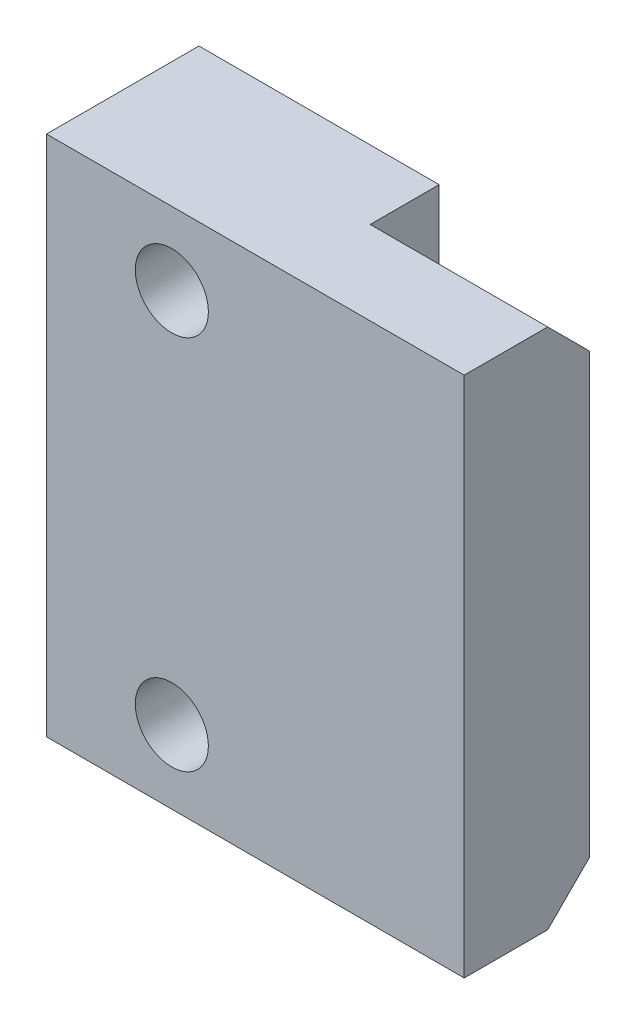
ISO-10303-21;
HEADER;
FILE_DESCRIPTION(('STEP AP214'),'2;1');
FILE_NAME('part.step','',(''),(''),'','','');
FILE_SCHEMA(('AUTOMOTIVE_DESIGN { 1 0 10303 214 1 1 1 1 }'));
ENDSEC;
DATA;
#1=APPLICATION_CONTEXT('core data for automotive mechanical design processes');
#2=APPLICATION_PROTOCOL_DEFINITION('international standard','automotive_design',2000,#1);
#3=PRODUCT_CONTEXT('',#1,'mechanical');
#4=PRODUCT('Part','Part','',(#3));
#5=PRODUCT_RELATED_PRODUCT_CATEGORY('part','',(#4));
#6=PRODUCT_DEFINITION_FORMATION('','',#4);
#7=PRODUCT_DEFINITION_CONTEXT('part definition',#1,'design');
#8=PRODUCT_DEFINITION('design','',#6,#7);
#9=PRODUCT_DEFINITION_SHAPE('','',#8);
#10=(LENGTH_UNIT() NAMED_UNIT(*) SI_UNIT(.MILLI.,.METRE.));
#11=(NAMED_UNIT(*) PLANE_ANGLE_UNIT() SI_UNIT($,.RADIAN.));
#12=(NAMED_UNIT(*) SI_UNIT($,.STERADIAN.) SOLID_ANGLE_UNIT());
#13=UNCERTAINTY_MEASURE_WITH_UNIT(LENGTH_MEASURE(1.E-05),#10,'distance_accuracy_value','');
#14=(GEOMETRIC_REPRESENTATION_CONTEXT(3) GLOBAL_UNCERTAINTY_ASSIGNED_CONTEXT((#13)) GLOBAL_UNIT_ASSIGNED_CONTEXT((#10,
#11,#12)) REPRESENTATION_CONTEXT('',''));
#15=CARTESIAN_POINT('',(0.,0.,0.));
#16=DIRECTION('',(0.,0.,1.));
#17=DIRECTION('',(1.,0.,0.));
#18=AXIS2_PLACEMENT_3D('',#15,#16,#17);
#19=CARTESIAN_POINT('',(-10.,12.5,-7.3));
#20=DIRECTION('',(1.,0.,0.));
#21=DIRECTION('',(0.,0.,-1.));
#22=AXIS2_PLACEMENT_3D('',#19,#20,#21);
#23=PLANE('',#22);
#24=DIRECTION('',(0.,0.,1.));
#25=VECTOR('',#24,1.);
#26=CARTESIAN_POINT('',(-10.,-12.5,-7.3));
#27=LINE('',#26,#25);
#28=CARTESIAN_POINT('',(-10.,-12.5,-7.3));
#29=VERTEX_POINT('',#28);
#30=CARTESIAN_POINT('',(-10.,-12.5,0.));
#31=VERTEX_POINT('',#30);
#32=EDGE_CURVE('E120',#29,#31,#27,.T.);
#33=ORIENTED_EDGE('',*,*,#32,.T.);
#34=DIRECTION('',(0.,-1.,0.));
#35=VECTOR('',#34,1.);
#36=CARTESIAN_POINT('',(-10.,12.5,0.));
#37=LINE('',#36,#35);
#38=CARTESIAN_POINT('',(-10.,12.5,0.));
#39=VERTEX_POINT('',#38);
#40=EDGE_CURVE('E102',#39,#31,#37,.T.);
#41=ORIENTED_EDGE('',*,*,#40,.F.);
#42=DIRECTION('',(0.,0.,1.));
#43=VECTOR('',#42,1.);
#44=CARTESIAN_POINT('',(-10.,12.5,-7.3));
#45=LINE('',#44,#43);
#46=CARTESIAN_POINT('',(-10.,12.5,-7.3));
#47=VERTEX_POINT('',#46);
#48=EDGE_CURVE('E108',#47,#39,#45,.T.);
#49=ORIENTED_EDGE('',*,*,#48,.F.);
#50=DIRECTION('',(0.,-1.,0.));
#51=VECTOR('',#50,1.);
#52=CARTESIAN_POINT('',(-10.,12.5,-7.3));
#53=LINE('',#52,#51);
#54=EDGE_CURVE('E165',#47,#29,#53,.T.);
#55=ORIENTED_EDGE('',*,*,#54,.T.);
#56=EDGE_LOOP('',(#33,#41,#49,#55));
#57=FACE_BOUND('',#56,.T.);
#58=ADVANCED_FACE('F32',(#57),#23,.F.);
#59=CARTESIAN_POINT('',(-10.,12.5,0.));
#60=DIRECTION('',(0.,0.,-1.));
#61=DIRECTION('',(-1.,0.,0.));
#62=AXIS2_PLACEMENT_3D('',#59,#60,#61);
#63=PLANE('',#62);
#64=CARTESIAN_POINT('',(-4.,-9.,0.));
#65=DIRECTION('',(0.,0.,1.));
#66=DIRECTION('',(1.,0.,0.));
#67=AXIS2_PLACEMENT_3D('',#64,#65,#66);
#68=CIRCLE('',#67,1.75);
#69=CARTESIAN_POINT('',(-2.25,-9.,0.));
#70=VERTEX_POINT('',#69);
#71=EDGE_CURVE('E187',#70,#70,#68,.T.);
#72=ORIENTED_EDGE('',*,*,#71,.F.);
#73=EDGE_LOOP('',(#72));
#74=FACE_BOUND('',#73,.T.);
#75=CARTESIAN_POINT('',(-4.,9.,0.));
#76=DIRECTION('',(0.,0.,1.));
#77=DIRECTION('',(1.,0.,0.));
#78=AXIS2_PLACEMENT_3D('',#75,#76,#77);
#79=CIRCLE('',#78,1.75);
#80=CARTESIAN_POINT('',(-2.25,9.,0.));
#81=VERTEX_POINT('',#80);
#82=EDGE_CURVE('E179',#81,#81,#79,.T.);
#83=ORIENTED_EDGE('',*,*,#82,.F.);
#84=EDGE_LOOP('',(#83));
#85=FACE_BOUND('',#84,.T.);
#86=DIRECTION('',(1.,0.,0.));
#87=VECTOR('',#86,1.);
#88=CARTESIAN_POINT('',(-10.,-12.5,0.));
#89=LINE('',#88,#87);
#90=CARTESIAN_POINT('',(10.,-12.5,0.));
#91=VERTEX_POINT('',#90);
#92=EDGE_CURVE('E158',#31,#91,#89,.T.);
#93=ORIENTED_EDGE('',*,*,#92,.T.);
#94=DIRECTION('',(0.,-1.,0.));
#95=VECTOR('',#94,1.);
#96=CARTESIAN_POINT('',(10.,12.5,0.));
#97=LINE('',#96,#95);
#98=CARTESIAN_POINT('',(10.,12.5,0.));
#99=VERTEX_POINT('',#98);
#100=EDGE_CURVE('E105',#99,#91,#97,.T.);
#101=ORIENTED_EDGE('',*,*,#100,.F.);
#102=DIRECTION('',(1.,0.,0.));
#103=VECTOR('',#102,1.);
#104=CARTESIAN_POINT('',(-10.,12.5,0.));
#105=LINE('',#104,#103);
#106=EDGE_CURVE('E98',#39,#99,#105,.T.);
#107=ORIENTED_EDGE('',*,*,#106,.F.);
#108=ORIENTED_EDGE('',*,*,#40,.T.);
#109=EDGE_LOOP('',(#93,#101,#107,#108));
#110=FACE_BOUND('',#109,.T.);
#111=ADVANCED_FACE('F100',(#74,#85,#110),#63,.F.);
#112=CARTESIAN_POINT('',(10.,12.5,-6.));
#113=DIRECTION('',(-1.,0.,0.));
#114=DIRECTION('',(0.,0.,1.));
#115=AXIS2_PLACEMENT_3D('',#112,#113,#114);
#116=PLANE('',#115);
#117=DIRECTION('',(0.,0.,-1.));
#118=VECTOR('',#117,1.);
#119=CARTESIAN_POINT('',(10.,-12.5,-6.));
#120=LINE('',#119,#118);
#121=CARTESIAN_POINT('',(10.,-12.5,-3.99999999999999));
#122=VERTEX_POINT('',#121);
#123=EDGE_CURVE('E154',#91,#122,#120,.T.);
#124=ORIENTED_EDGE('',*,*,#123,.T.);
#125=DIRECTION('',(0.,-0.707106781186547,0.707106781186548));
#126=VECTOR('',#125,1.);
#127=CARTESIAN_POINT('',(10.,-10.5,-6.));
#128=LINE('',#127,#126);
#129=CARTESIAN_POINT('',(10.,-10.5,-6.));
#130=VERTEX_POINT('',#129);
#131=EDGE_CURVE('E134',#122,#130,#128,.F.);
#132=ORIENTED_EDGE('',*,*,#131,.T.);
#133=DIRECTION('',(0.,-1.,0.));
#134=VECTOR('',#133,1.);
#135=CARTESIAN_POINT('',(10.,12.5,-6.));
#136=LINE('',#135,#134);
#137=CARTESIAN_POINT('',(10.,10.5,-6.));
#138=VERTEX_POINT('',#137);
#139=EDGE_CURVE('E125',#138,#130,#136,.T.);
#140=ORIENTED_EDGE('',*,*,#139,.F.);
#141=DIRECTION('',(0.,0.707106781186549,0.707106781186546));
#142=VECTOR('',#141,1.);
#143=CARTESIAN_POINT('',(10.,12.5,-4.));
#144=LINE('',#143,#142);
#145=CARTESIAN_POINT('',(10.,12.5,-4.));
#146=VERTEX_POINT('',#145);
#147=EDGE_CURVE('E54',#138,#146,#144,.T.);
#148=ORIENTED_EDGE('',*,*,#147,.T.);
#149=DIRECTION('',(0.,0.,-1.));
#150=VECTOR('',#149,1.);
#151=CARTESIAN_POINT('',(10.,12.5,-6.));
#152=LINE('',#151,#150);
#153=EDGE_CURVE('E107',#99,#146,#152,.T.);
#154=ORIENTED_EDGE('',*,*,#153,.F.);
#155=ORIENTED_EDGE('',*,*,#100,.T.);
#156=EDGE_LOOP('',(#124,#132,#140,#148,#154,#155));
#157=FACE_BOUND('',#156,.T.);
#158=ADVANCED_FACE('F156',(#157),#116,.F.);
#159=CARTESIAN_POINT('',(1.5,12.5,-6.));
#160=DIRECTION('',(0.,0.,1.));
#161=DIRECTION('',(1.,0.,0.));
#162=AXIS2_PLACEMENT_3D('',#159,#160,#161);
#163=PLANE('',#162);
#164=ORIENTED_EDGE('',*,*,#139,.T.);
#165=DIRECTION('',(-1.,0.,0.));
#166=VECTOR('',#165,1.);
#167=CARTESIAN_POINT('',(1.5,-10.5,-6.));
#168=LINE('',#167,#166);
#169=CARTESIAN_POINT('',(1.5,-10.5,-6.));
#170=VERTEX_POINT('',#169);
#171=EDGE_CURVE('E123',#130,#170,#168,.T.);
#172=ORIENTED_EDGE('',*,*,#171,.T.);
#173=DIRECTION('',(0.,-1.,0.));
#174=VECTOR('',#173,1.);
#175=CARTESIAN_POINT('',(1.5,12.5,-6.));
#176=LINE('',#175,#174);
#177=CARTESIAN_POINT('',(1.5,10.5,-6.));
#178=VERTEX_POINT('',#177);
#179=EDGE_CURVE('E145',#178,#170,#176,.T.);
#180=ORIENTED_EDGE('',*,*,#179,.F.);
#181=DIRECTION('',(1.,0.,0.));
#182=VECTOR('',#181,1.);
#183=CARTESIAN_POINT('',(10.,10.5,-6.));
#184=LINE('',#183,#182);
#185=EDGE_CURVE('E121',#178,#138,#184,.T.);
#186=ORIENTED_EDGE('',*,*,#185,.T.);
#187=EDGE_LOOP('',(#164,#172,#180,#186));
#188=FACE_BOUND('',#187,.T.);
#189=ADVANCED_FACE('F170',(#188),#163,.F.);
#190=CARTESIAN_POINT('',(1.5,12.5,-7.3));
#191=DIRECTION('',(-1.,0.,0.));
#192=DIRECTION('',(0.,0.,1.));
#193=AXIS2_PLACEMENT_3D('',#190,#191,#192);
#194=PLANE('',#193);
#195=DIRECTION('',(0.,0.,-1.));
#196=VECTOR('',#195,1.);
#197=CARTESIAN_POINT('',(1.5,-12.5,-7.3));
#198=LINE('',#197,#196);
#199=CARTESIAN_POINT('',(1.5,-12.5,-3.99999999999999));
#200=VERTEX_POINT('',#199);
#201=CARTESIAN_POINT('',(1.5,-12.5,-7.3));
#202=VERTEX_POINT('',#201);
#203=EDGE_CURVE('E142',#200,#202,#198,.T.);
#204=ORIENTED_EDGE('',*,*,#203,.T.);
#205=DIRECTION('',(0.,-1.,0.));
#206=VECTOR('',#205,1.);
#207=CARTESIAN_POINT('',(1.5,12.5,-7.3));
#208=LINE('',#207,#206);
#209=CARTESIAN_POINT('',(1.5,12.5,-7.3));
#210=VERTEX_POINT('',#209);
#211=EDGE_CURVE('E167',#210,#202,#208,.T.);
#212=ORIENTED_EDGE('',*,*,#211,.F.);
#213=DIRECTION('',(0.,0.,-1.));
#214=VECTOR('',#213,1.);
#215=CARTESIAN_POINT('',(1.5,12.5,-7.3));
#216=LINE('',#215,#214);
#217=CARTESIAN_POINT('',(1.5,12.5,-4.));
#218=VERTEX_POINT('',#217);
#219=EDGE_CURVE('E46',#218,#210,#216,.T.);
#220=ORIENTED_EDGE('',*,*,#219,.F.);
#221=DIRECTION('',(0.,-0.707106781186549,-0.707106781186546));
#222=VECTOR('',#221,1.);
#223=CARTESIAN_POINT('',(1.5,10.85,-5.65));
#224=LINE('',#223,#222);
#225=EDGE_CURVE('E11',#218,#178,#224,.T.);
#226=ORIENTED_EDGE('',*,*,#225,.T.);
#227=ORIENTED_EDGE('',*,*,#179,.T.);
#228=DIRECTION('',(0.,0.707106781186547,-0.707106781186548));
#229=VECTOR('',#228,1.);
#230=CARTESIAN_POINT('',(1.5,1.64999999999998,-18.15));
#231=LINE('',#230,#229);
#232=EDGE_CURVE('E40',#170,#200,#231,.F.);
#233=ORIENTED_EDGE('',*,*,#232,.T.);
#234=EDGE_LOOP('',(#204,#212,#220,#226,#227,#233));
#235=FACE_BOUND('',#234,.T.);
#236=ADVANCED_FACE('F141',(#235),#194,.F.);
#237=CARTESIAN_POINT('',(-10.,12.5,-7.3));
#238=DIRECTION('',(0.,0.,1.));
#239=DIRECTION('',(1.,0.,0.));
#240=AXIS2_PLACEMENT_3D('',#237,#238,#239);
#241=PLANE('',#240);
#242=CARTESIAN_POINT('',(-4.,-9.,-7.3));
#243=DIRECTION('',(0.,0.,1.));
#244=DIRECTION('',(1.,0.,0.));
#245=AXIS2_PLACEMENT_3D('',#242,#243,#244);
#246=CIRCLE('',#245,1.75);
#247=CARTESIAN_POINT('',(-2.25,-9.,-7.3));
#248=VERTEX_POINT('',#247);
#249=EDGE_CURVE('E184',#248,#248,#246,.T.);
#250=ORIENTED_EDGE('',*,*,#249,.T.);
#251=EDGE_LOOP('',(#250));
#252=FACE_BOUND('',#251,.T.);
#253=CARTESIAN_POINT('',(-4.,9.,-7.3));
#254=DIRECTION('',(0.,0.,1.));
#255=DIRECTION('',(1.,0.,0.));
#256=AXIS2_PLACEMENT_3D('',#253,#254,#255);
#257=CIRCLE('',#256,1.75);
#258=CARTESIAN_POINT('',(-2.25,9.,-7.3));
#259=VERTEX_POINT('',#258);
#260=EDGE_CURVE('E177',#259,#259,#257,.T.);
#261=ORIENTED_EDGE('',*,*,#260,.T.);
#262=EDGE_LOOP('',(#261));
#263=FACE_BOUND('',#262,.T.);
#264=DIRECTION('',(-1.,0.,0.));
#265=VECTOR('',#264,1.);
#266=CARTESIAN_POINT('',(-10.,-12.5,-7.3));
#267=LINE('',#266,#265);
#268=EDGE_CURVE('E117',#202,#29,#267,.T.);
#269=ORIENTED_EDGE('',*,*,#268,.T.);
#270=ORIENTED_EDGE('',*,*,#54,.F.);
#271=DIRECTION('',(-1.,0.,0.));
#272=VECTOR('',#271,1.);
#273=CARTESIAN_POINT('',(-10.,12.5,-7.3));
#274=LINE('',#273,#272);
#275=EDGE_CURVE('E113',#210,#47,#274,.T.);
#276=ORIENTED_EDGE('',*,*,#275,.F.);
#277=ORIENTED_EDGE('',*,*,#211,.T.);
#278=EDGE_LOOP('',(#269,#270,#276,#277));
#279=FACE_BOUND('',#278,.T.);
#280=ADVANCED_FACE('F193',(#252,#263,#279),#241,.F.);
#281=CARTESIAN_POINT('',(0.,12.5,0.));
#282=DIRECTION('',(0.,1.,0.));
#283=DIRECTION('',(0.,0.,1.));
#284=AXIS2_PLACEMENT_3D('',#281,#282,#283);
#285=PLANE('',#284);
#286=ORIENTED_EDGE('',*,*,#153,.T.);
#287=DIRECTION('',(-1.,0.,0.));
#288=VECTOR('',#287,1.);
#289=CARTESIAN_POINT('',(1.5,12.5,-4.));
#290=LINE('',#289,#288);
#291=EDGE_CURVE('E136',#146,#218,#290,.T.);
#292=ORIENTED_EDGE('',*,*,#291,.T.);
#293=ORIENTED_EDGE('',*,*,#219,.T.);
#294=ORIENTED_EDGE('',*,*,#275,.T.);
#295=ORIENTED_EDGE('',*,*,#48,.T.);
#296=ORIENTED_EDGE('',*,*,#106,.T.);
#297=EDGE_LOOP('',(#286,#292,#293,#294,#295,#296));
#298=FACE_BOUND('',#297,.T.);
#299=ADVANCED_FACE('F111',(#298),#285,.T.);
#300=CARTESIAN_POINT('',(0.,-12.5,0.));
#301=DIRECTION('',(0.,1.,0.));
#302=DIRECTION('',(0.,0.,1.));
#303=AXIS2_PLACEMENT_3D('',#300,#301,#302);
#304=PLANE('',#303);
#305=ORIENTED_EDGE('',*,*,#203,.F.);
#306=DIRECTION('',(1.,0.,0.));
#307=VECTOR('',#306,1.);
#308=CARTESIAN_POINT('',(0.,-12.5,-3.99999999999999));
#309=LINE('',#308,#307);
#310=EDGE_CURVE('E131',#200,#122,#309,.T.);
#311=ORIENTED_EDGE('',*,*,#310,.T.);
#312=ORIENTED_EDGE('',*,*,#123,.F.);
#313=ORIENTED_EDGE('',*,*,#92,.F.);
#314=ORIENTED_EDGE('',*,*,#32,.F.);
#315=ORIENTED_EDGE('',*,*,#268,.F.);
#316=EDGE_LOOP('',(#305,#311,#312,#313,#314,#315));
#317=FACE_BOUND('',#316,.T.);
#318=ADVANCED_FACE('F153',(#317),#304,.F.);
#319=CARTESIAN_POINT('',(-4.,9.,-7.3));
#320=DIRECTION('',(0.,0.,1.));
#321=DIRECTION('',(1.,0.,0.));
#322=AXIS2_PLACEMENT_3D('',#319,#320,#321);
#323=CYLINDRICAL_SURFACE('',#322,1.75);
#324=ORIENTED_EDGE('',*,*,#260,.F.);
#325=EDGE_LOOP('',(#324));
#326=FACE_BOUND('',#325,.T.);
#327=ORIENTED_EDGE('',*,*,#82,.T.);
#328=EDGE_LOOP('',(#327));
#329=FACE_BOUND('',#328,.T.);
#330=ADVANCED_FACE('F198',(#326,#329),#323,.F.);
#331=CARTESIAN_POINT('',(-4.,-9.,-7.3));
#332=DIRECTION('',(0.,0.,1.));
#333=DIRECTION('',(1.,0.,0.));
#334=AXIS2_PLACEMENT_3D('',#331,#332,#333);
#335=CYLINDRICAL_SURFACE('',#334,1.75);
#336=ORIENTED_EDGE('',*,*,#249,.F.);
#337=EDGE_LOOP('',(#336));
#338=FACE_BOUND('',#337,.T.);
#339=ORIENTED_EDGE('',*,*,#71,.T.);
#340=EDGE_LOOP('',(#339));
#341=FACE_BOUND('',#340,.T.);
#342=ADVANCED_FACE('F195',(#338,#341),#335,.F.);
#343=CARTESIAN_POINT('',(1.5,-10.5,-6.));
#344=DIRECTION('',(0.,0.707106781186548,0.707106781186547));
#345=DIRECTION('',(-1.,0.,0.));
#346=AXIS2_PLACEMENT_3D('',#343,#344,#345);
#347=PLANE('',#346);
#348=ORIENTED_EDGE('',*,*,#131,.F.);
#349=ORIENTED_EDGE('',*,*,#310,.F.);
#350=ORIENTED_EDGE('',*,*,#232,.F.);
#351=ORIENTED_EDGE('',*,*,#171,.F.);
#352=EDGE_LOOP('',(#348,#349,#350,#351));
#353=FACE_BOUND('',#352,.T.);
#354=ADVANCED_FACE('F149',(#353),#347,.F.);
#355=CARTESIAN_POINT('',(0.,12.5,-4.));
#356=DIRECTION('',(0.,0.707106781186546,-0.707106781186549));
#357=DIRECTION('',(1.,0.,0.));
#358=AXIS2_PLACEMENT_3D('',#355,#356,#357);
#359=PLANE('',#358);
#360=ORIENTED_EDGE('',*,*,#147,.F.);
#361=ORIENTED_EDGE('',*,*,#185,.F.);
#362=ORIENTED_EDGE('',*,*,#225,.F.);
#363=ORIENTED_EDGE('',*,*,#291,.F.);
#364=EDGE_LOOP('',(#360,#361,#362,#363));
#365=FACE_BOUND('',#364,.T.);
#366=ADVANCED_FACE('F34',(#365),#359,.T.);
#367=CLOSED_SHELL('',(#58,#111,#158,#189,#236,#280,#299,#318,#330,#342,#354,#366));
#368=MANIFOLD_SOLID_BREP('B2',#367);
#369=ADVANCED_BREP_SHAPE_REPRESENTATION('',(#18,#368),#14);
#370=SHAPE_DEFINITION_REPRESENTATION(#9,#369);
ENDSEC;
END-ISO-10303-21;
